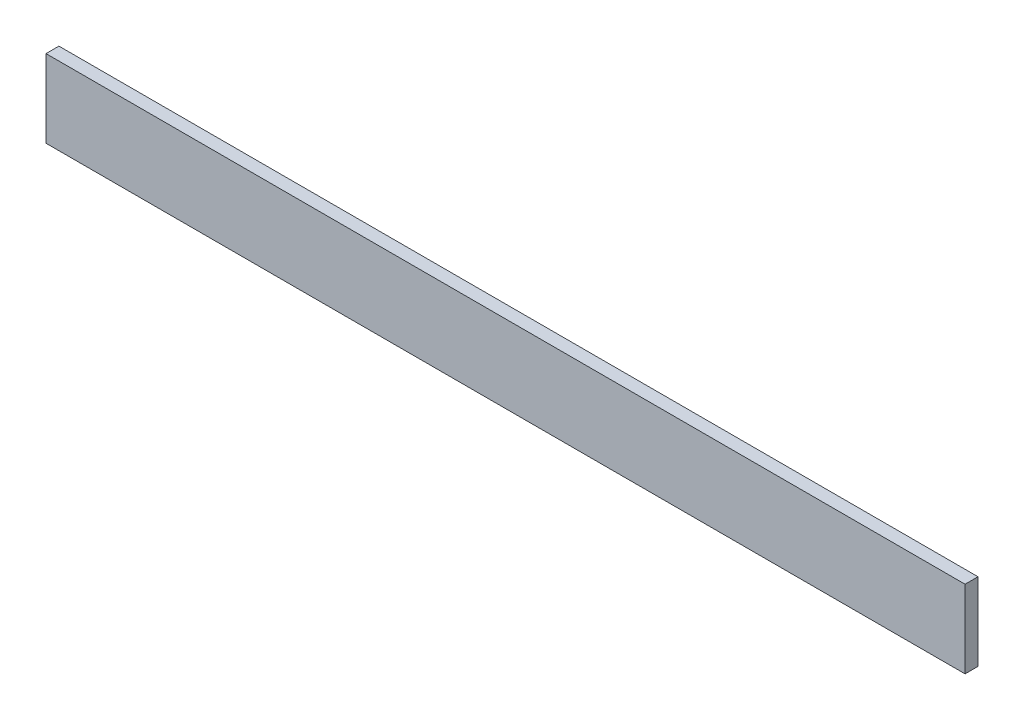
ISO-10303-21;
HEADER;
FILE_DESCRIPTION(('STEP AP214'),'2;1');
FILE_NAME('part.step','',(''),(''),'','','');
FILE_SCHEMA(('AUTOMOTIVE_DESIGN { 1 0 10303 214 1 1 1 1 }'));
ENDSEC;
DATA;
#1=APPLICATION_CONTEXT('core data for automotive mechanical design processes');
#2=APPLICATION_PROTOCOL_DEFINITION('international standard','automotive_design',2000,#1);
#3=PRODUCT_CONTEXT('',#1,'mechanical');
#4=PRODUCT('Part','Part','',(#3));
#5=PRODUCT_RELATED_PRODUCT_CATEGORY('part','',(#4));
#6=PRODUCT_DEFINITION_FORMATION('','',#4);
#7=PRODUCT_DEFINITION_CONTEXT('part definition',#1,'design');
#8=PRODUCT_DEFINITION('design','',#6,#7);
#9=PRODUCT_DEFINITION_SHAPE('','',#8);
#10=(LENGTH_UNIT() NAMED_UNIT(*) SI_UNIT(.MILLI.,.METRE.));
#11=(NAMED_UNIT(*) PLANE_ANGLE_UNIT() SI_UNIT($,.RADIAN.));
#12=(NAMED_UNIT(*) SI_UNIT($,.STERADIAN.) SOLID_ANGLE_UNIT());
#13=UNCERTAINTY_MEASURE_WITH_UNIT(LENGTH_MEASURE(1.E-05),#10,'distance_accuracy_value','');
#14=(GEOMETRIC_REPRESENTATION_CONTEXT(3) GLOBAL_UNCERTAINTY_ASSIGNED_CONTEXT((#13)) GLOBAL_UNIT_ASSIGNED_CONTEXT((#10,
#11,#12)) REPRESENTATION_CONTEXT('',''));
#15=CARTESIAN_POINT('',(0.,0.,0.));
#16=DIRECTION('',(0.,0.,1.));
#17=DIRECTION('',(1.,0.,0.));
#18=AXIS2_PLACEMENT_3D('',#15,#16,#17);
#19=CARTESIAN_POINT('',(3606.8,0.,0.));
#20=DIRECTION('',(0.,0.,-1.));
#21=DIRECTION('',(-1.,0.,0.));
#22=AXIS2_PLACEMENT_3D('',#19,#20,#21);
#23=PLANE('',#22);
#24=DIRECTION('',(0.,-1.,0.));
#25=VECTOR('',#24,1.);
#26=CARTESIAN_POINT('',(0.,0.,0.));
#27=LINE('',#26,#25);
#28=CARTESIAN_POINT('',(0.,304.8,0.));
#29=VERTEX_POINT('',#28);
#30=CARTESIAN_POINT('',(0.,0.,0.));
#31=VERTEX_POINT('',#30);
#32=EDGE_CURVE('E95',#29,#31,#27,.T.);
#33=ORIENTED_EDGE('',*,*,#32,.T.);
#34=DIRECTION('',(-1.,0.,0.));
#35=VECTOR('',#34,1.);
#36=CARTESIAN_POINT('',(3606.8,0.,0.));
#37=LINE('',#36,#35);
#38=CARTESIAN_POINT('',(3606.8,0.,0.));
#39=VERTEX_POINT('',#38);
#40=EDGE_CURVE('E11',#39,#31,#37,.T.);
#41=ORIENTED_EDGE('',*,*,#40,.F.);
#42=DIRECTION('',(0.,-1.,0.));
#43=VECTOR('',#42,1.);
#44=CARTESIAN_POINT('',(3606.8,0.,0.));
#45=LINE('',#44,#43);
#46=CARTESIAN_POINT('',(3606.8,304.8,0.));
#47=VERTEX_POINT('',#46);
#48=EDGE_CURVE('E83',#47,#39,#45,.T.);
#49=ORIENTED_EDGE('',*,*,#48,.F.);
#50=DIRECTION('',(-1.,0.,0.));
#51=VECTOR('',#50,1.);
#52=CARTESIAN_POINT('',(3606.8,304.8,0.));
#53=LINE('',#52,#51);
#54=EDGE_CURVE('E91',#47,#29,#53,.T.);
#55=ORIENTED_EDGE('',*,*,#54,.T.);
#56=EDGE_LOOP('',(#33,#41,#49,#55));
#57=FACE_BOUND('',#56,.T.);
#58=ADVANCED_FACE('F32',(#57),#23,.F.);
#59=CARTESIAN_POINT('',(3606.8,0.,0.));
#60=DIRECTION('',(0.,1.,0.));
#61=DIRECTION('',(0.,0.,1.));
#62=AXIS2_PLACEMENT_3D('',#59,#60,#61);
#63=PLANE('',#62);
#64=DIRECTION('',(0.,0.,-1.));
#65=VECTOR('',#64,1.);
#66=CARTESIAN_POINT('',(0.,0.,0.));
#67=LINE('',#66,#65);
#68=CARTESIAN_POINT('',(0.,0.,-50.8));
#69=VERTEX_POINT('',#68);
#70=EDGE_CURVE('E87',#31,#69,#67,.T.);
#71=ORIENTED_EDGE('',*,*,#70,.T.);
#72=DIRECTION('',(-1.,0.,0.));
#73=VECTOR('',#72,1.);
#74=CARTESIAN_POINT('',(3606.8,0.,-50.8));
#75=LINE('',#74,#73);
#76=CARTESIAN_POINT('',(3606.8,0.,-50.8));
#77=VERTEX_POINT('',#76);
#78=EDGE_CURVE('E40',#77,#69,#75,.T.);
#79=ORIENTED_EDGE('',*,*,#78,.F.);
#80=DIRECTION('',(0.,0.,-1.));
#81=VECTOR('',#80,1.);
#82=CARTESIAN_POINT('',(3606.8,0.,0.));
#83=LINE('',#82,#81);
#84=EDGE_CURVE('E78',#39,#77,#83,.T.);
#85=ORIENTED_EDGE('',*,*,#84,.F.);
#86=ORIENTED_EDGE('',*,*,#40,.T.);
#87=EDGE_LOOP('',(#71,#79,#85,#86));
#88=FACE_BOUND('',#87,.T.);
#89=ADVANCED_FACE('F86',(#88),#63,.F.);
#90=CARTESIAN_POINT('',(3606.8,0.,-50.8));
#91=DIRECTION('',(0.,0.,1.));
#92=DIRECTION('',(1.,0.,0.));
#93=AXIS2_PLACEMENT_3D('',#90,#91,#92);
#94=PLANE('',#93);
#95=DIRECTION('',(0.,1.,0.));
#96=VECTOR('',#95,1.);
#97=CARTESIAN_POINT('',(0.,0.,-50.8));
#98=LINE('',#97,#96);
#99=CARTESIAN_POINT('',(0.,304.8,-50.8));
#100=VERTEX_POINT('',#99);
#101=EDGE_CURVE('E65',#69,#100,#98,.T.);
#102=ORIENTED_EDGE('',*,*,#101,.T.);
#103=DIRECTION('',(-1.,0.,0.));
#104=VECTOR('',#103,1.);
#105=CARTESIAN_POINT('',(3606.8,304.8,-50.8));
#106=LINE('',#105,#104);
#107=CARTESIAN_POINT('',(3606.8,304.8,-50.8));
#108=VERTEX_POINT('',#107);
#109=EDGE_CURVE('E88',#108,#100,#106,.T.);
#110=ORIENTED_EDGE('',*,*,#109,.F.);
#111=DIRECTION('',(0.,1.,0.));
#112=VECTOR('',#111,1.);
#113=CARTESIAN_POINT('',(3606.8,0.,-50.8));
#114=LINE('',#113,#112);
#115=EDGE_CURVE('E81',#77,#108,#114,.T.);
#116=ORIENTED_EDGE('',*,*,#115,.F.);
#117=ORIENTED_EDGE('',*,*,#78,.T.);
#118=EDGE_LOOP('',(#102,#110,#116,#117));
#119=FACE_BOUND('',#118,.T.);
#120=ADVANCED_FACE('F89',(#119),#94,.F.);
#121=CARTESIAN_POINT('',(3606.8,304.8,0.));
#122=DIRECTION('',(0.,-1.,0.));
#123=DIRECTION('',(0.,0.,-1.));
#124=AXIS2_PLACEMENT_3D('',#121,#122,#123);
#125=PLANE('',#124);
#126=DIRECTION('',(0.,0.,1.));
#127=VECTOR('',#126,1.);
#128=CARTESIAN_POINT('',(0.,304.8,0.));
#129=LINE('',#128,#127);
#130=EDGE_CURVE('E71',#100,#29,#129,.T.);
#131=ORIENTED_EDGE('',*,*,#130,.T.);
#132=ORIENTED_EDGE('',*,*,#54,.F.);
#133=DIRECTION('',(0.,0.,1.));
#134=VECTOR('',#133,1.);
#135=CARTESIAN_POINT('',(3606.8,304.8,0.));
#136=LINE('',#135,#134);
#137=EDGE_CURVE('E48',#108,#47,#136,.T.);
#138=ORIENTED_EDGE('',*,*,#137,.F.);
#139=ORIENTED_EDGE('',*,*,#109,.T.);
#140=EDGE_LOOP('',(#131,#132,#138,#139));
#141=FACE_BOUND('',#140,.T.);
#142=ADVANCED_FACE('F102',(#141),#125,.F.);
#143=CARTESIAN_POINT('',(3606.8,0.,0.));
#144=DIRECTION('',(-1.,0.,0.));
#145=DIRECTION('',(0.,0.,1.));
#146=AXIS2_PLACEMENT_3D('',#143,#144,#145);
#147=PLANE('',#146);
#148=ORIENTED_EDGE('',*,*,#48,.T.);
#149=ORIENTED_EDGE('',*,*,#84,.T.);
#150=ORIENTED_EDGE('',*,*,#115,.T.);
#151=ORIENTED_EDGE('',*,*,#137,.T.);
#152=EDGE_LOOP('',(#148,#149,#150,#151));
#153=FACE_BOUND('',#152,.T.);
#154=ADVANCED_FACE('F79',(#153),#147,.F.);
#155=CARTESIAN_POINT('',(0.,0.,0.));
#156=DIRECTION('',(-1.,0.,0.));
#157=DIRECTION('',(0.,0.,1.));
#158=AXIS2_PLACEMENT_3D('',#155,#156,#157);
#159=PLANE('',#158);
#160=ORIENTED_EDGE('',*,*,#32,.F.);
#161=ORIENTED_EDGE('',*,*,#130,.F.);
#162=ORIENTED_EDGE('',*,*,#101,.F.);
#163=ORIENTED_EDGE('',*,*,#70,.F.);
#164=EDGE_LOOP('',(#160,#161,#162,#163));
#165=FACE_BOUND('',#164,.T.);
#166=ADVANCED_FACE('F105',(#165),#159,.T.);
#167=CLOSED_SHELL('',(#58,#89,#120,#142,#154,#166));
#168=MANIFOLD_SOLID_BREP('B2',#167);
#169=ADVANCED_BREP_SHAPE_REPRESENTATION('',(#18,#168),#14);
#170=SHAPE_DEFINITION_REPRESENTATION(#9,#169);
ENDSEC;
END-ISO-10303-21;
